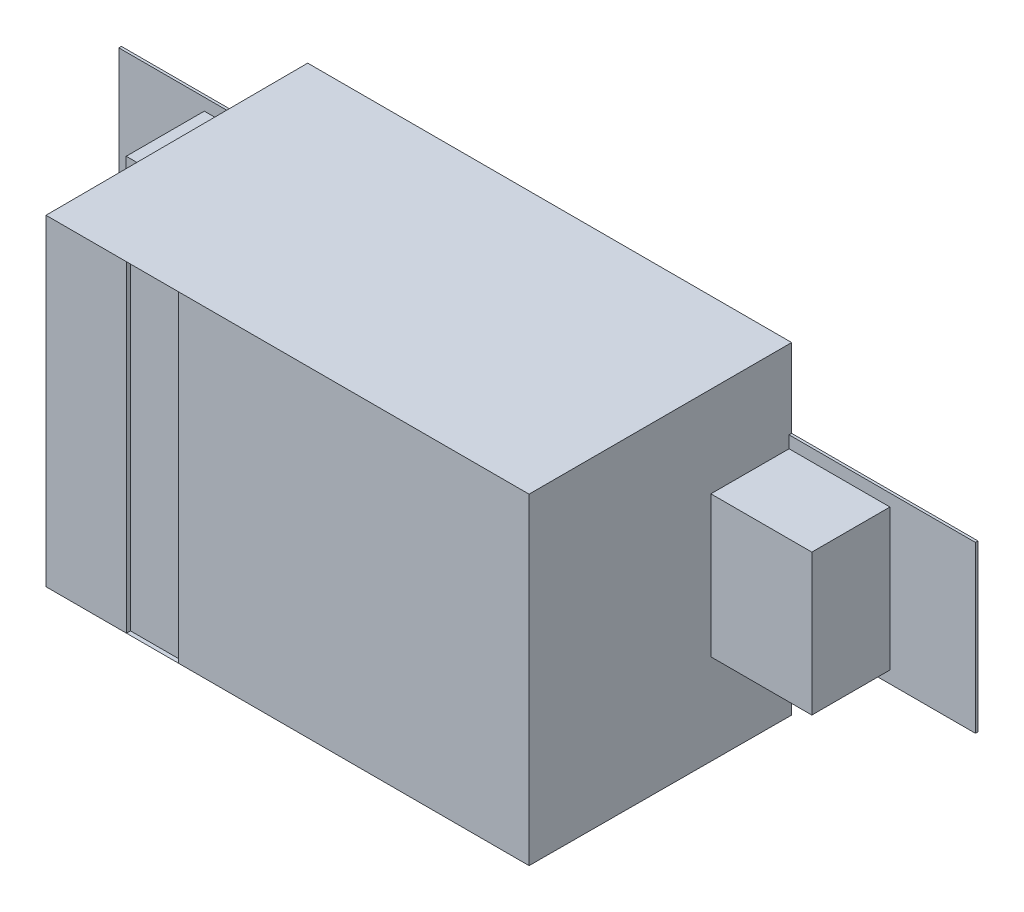
ISO-10303-21;
HEADER;
FILE_DESCRIPTION(('STEP AP214'),'2;1');
FILE_NAME('part.step','',(''),(''),'','','');
FILE_SCHEMA(('AUTOMOTIVE_DESIGN { 1 0 10303 214 1 1 1 1 }'));
ENDSEC;
DATA;
#1=APPLICATION_CONTEXT('core data for automotive mechanical design processes');
#2=APPLICATION_PROTOCOL_DEFINITION('international standard','automotive_design',2000,#1);
#3=PRODUCT_CONTEXT('',#1,'mechanical');
#4=PRODUCT('Part','Part','',(#3));
#5=PRODUCT_RELATED_PRODUCT_CATEGORY('part','',(#4));
#6=PRODUCT_DEFINITION_FORMATION('','',#4);
#7=PRODUCT_DEFINITION_CONTEXT('part definition',#1,'design');
#8=PRODUCT_DEFINITION('design','',#6,#7);
#9=PRODUCT_DEFINITION_SHAPE('','',#8);
#10=(LENGTH_UNIT() NAMED_UNIT(*) SI_UNIT(.MILLI.,.METRE.));
#11=(NAMED_UNIT(*) PLANE_ANGLE_UNIT() SI_UNIT($,.RADIAN.));
#12=(NAMED_UNIT(*) SI_UNIT($,.STERADIAN.) SOLID_ANGLE_UNIT());
#13=UNCERTAINTY_MEASURE_WITH_UNIT(LENGTH_MEASURE(1.E-05),#10,'distance_accuracy_value','');
#14=(GEOMETRIC_REPRESENTATION_CONTEXT(3) GLOBAL_UNCERTAINTY_ASSIGNED_CONTEXT((#13)) GLOBAL_UNIT_ASSIGNED_CONTEXT((#10,
#11,#12)) REPRESENTATION_CONTEXT('',''));
#15=CARTESIAN_POINT('',(0.,0.,0.));
#16=DIRECTION('',(0.,0.,1.));
#17=DIRECTION('',(1.,0.,0.));
#18=AXIS2_PLACEMENT_3D('',#15,#16,#17);
#19=CARTESIAN_POINT('',(0.849999999999902,0.175000000000011,0.0030000000000007));
#20=DIRECTION('',(1.,0.,0.));
#21=DIRECTION('',(0.,0.,-1.));
#22=AXIS2_PLACEMENT_3D('',#19,#20,#21);
#23=PLANE('',#22);
#24=DIRECTION('',(0.,0.,-1.));
#25=VECTOR('',#24,1.);
#26=CARTESIAN_POINT('',(0.849999999999902,-0.175000000000011,0.0030000000000007));
#27=LINE('',#26,#25);
#28=CARTESIAN_POINT('',(0.849999999999902,-0.175000000000011,0.0093500000000007));
#29=VERTEX_POINT('',#28);
#30=CARTESIAN_POINT('',(0.849999999999902,-0.175000000000011,0.203000000000001));
#31=VERTEX_POINT('',#30);
#32=EDGE_CURVE('E175',#29,#31,#27,.F.);
#33=ORIENTED_EDGE('',*,*,#32,.F.);
#34=DIRECTION('',(0.,1.,0.));
#35=VECTOR('',#34,1.);
#36=CARTESIAN_POINT('',(0.849999999999902,0.,0.0093500000000007));
#37=LINE('',#36,#35);
#38=CARTESIAN_POINT('',(0.849999999999902,0.175000000000011,0.0093500000000007));
#39=VERTEX_POINT('',#38);
#40=EDGE_CURVE('E182',#29,#39,#37,.T.);
#41=ORIENTED_EDGE('',*,*,#40,.T.);
#42=DIRECTION('',(0.,0.,1.));
#43=VECTOR('',#42,1.);
#44=CARTESIAN_POINT('',(0.849999999999902,0.175000000000011,0.0030000000000007));
#45=LINE('',#44,#43);
#46=CARTESIAN_POINT('',(0.849999999999902,0.175000000000011,0.203000000000001));
#47=VERTEX_POINT('',#46);
#48=EDGE_CURVE('E343',#47,#39,#45,.F.);
#49=ORIENTED_EDGE('',*,*,#48,.F.);
#50=DIRECTION('',(0.,1.,0.));
#51=VECTOR('',#50,1.);
#52=CARTESIAN_POINT('',(0.849999999999902,0.,0.203000000000001));
#53=LINE('',#52,#51);
#54=EDGE_CURVE('E194',#47,#31,#53,.F.);
#55=ORIENTED_EDGE('',*,*,#54,.T.);
#56=EDGE_LOOP('',(#33,#41,#49,#55));
#57=FACE_BOUND('',#56,.T.);
#58=ADVANCED_FACE('F17',(#57),#23,.T.);
#59=CARTESIAN_POINT('',(-0.849999999999902,-0.175000000000011,0.0030000000000007));
#60=DIRECTION('',(-1.,0.,0.));
#61=DIRECTION('',(0.,0.,1.));
#62=AXIS2_PLACEMENT_3D('',#59,#60,#61);
#63=PLANE('',#62);
#64=DIRECTION('',(0.,0.,1.));
#65=VECTOR('',#64,1.);
#66=CARTESIAN_POINT('',(-0.849999999999902,0.175000000000011,0.0030000000000007));
#67=LINE('',#66,#65);
#68=CARTESIAN_POINT('',(-0.849999999999902,0.175000000000011,0.0093500000000007));
#69=VERTEX_POINT('',#68);
#70=CARTESIAN_POINT('',(-0.849999999999902,0.175000000000011,0.203000000000001));
#71=VERTEX_POINT('',#70);
#72=EDGE_CURVE('E323',#69,#71,#67,.T.);
#73=ORIENTED_EDGE('',*,*,#72,.F.);
#74=DIRECTION('',(0.,1.,0.));
#75=VECTOR('',#74,1.);
#76=CARTESIAN_POINT('',(-0.849999999999902,0.,0.0093500000000007));
#77=LINE('',#76,#75);
#78=CARTESIAN_POINT('',(-0.849999999999902,-0.175000000000011,0.0093500000000007));
#79=VERTEX_POINT('',#78);
#80=EDGE_CURVE('E330',#69,#79,#77,.F.);
#81=ORIENTED_EDGE('',*,*,#80,.T.);
#82=DIRECTION('',(0.,0.,-1.));
#83=VECTOR('',#82,1.);
#84=CARTESIAN_POINT('',(-0.849999999999902,-0.175000000000011,0.0030000000000007));
#85=LINE('',#84,#83);
#86=CARTESIAN_POINT('',(-0.849999999999902,-0.175000000000011,0.203000000000001));
#87=VERTEX_POINT('',#86);
#88=EDGE_CURVE('E312',#87,#79,#85,.T.);
#89=ORIENTED_EDGE('',*,*,#88,.F.);
#90=DIRECTION('',(0.,1.,0.));
#91=VECTOR('',#90,1.);
#92=CARTESIAN_POINT('',(-0.849999999999902,0.,0.203000000000001));
#93=LINE('',#92,#91);
#94=EDGE_CURVE('E320',#87,#71,#93,.T.);
#95=ORIENTED_EDGE('',*,*,#94,.T.);
#96=EDGE_LOOP('',(#73,#81,#89,#95));
#97=FACE_BOUND('',#96,.T.);
#98=ADVANCED_FACE('F654',(#97),#63,.T.);
#99=CARTESIAN_POINT('',(-0.399389278385962,0.39886555926881,0.652985999999988));
#100=DIRECTION('',(-1.,0.,0.));
#101=DIRECTION('',(0.,0.,1.));
#102=AXIS2_PLACEMENT_3D('',#99,#100,#101);
#103=PLANE('',#102);
#104=DIRECTION('',(0.,1.,0.));
#105=VECTOR('',#104,1.);
#106=CARTESIAN_POINT('',(-0.399389278385962,0.,0.642986000000028));
#107=LINE('',#106,#105);
#108=CARTESIAN_POINT('',(-0.399389278385962,0.39886555926881,0.642986000000028));
#109=VERTEX_POINT('',#108);
#110=CARTESIAN_POINT('',(-0.399389278385962,-0.39886555926881,0.642986000000028));
#111=VERTEX_POINT('',#110);
#112=EDGE_CURVE('E203',#109,#111,#107,.F.);
#113=ORIENTED_EDGE('',*,*,#112,.F.);
#114=DIRECTION('',(0.,0.,1.));
#115=VECTOR('',#114,1.);
#116=CARTESIAN_POINT('',(-0.399389278385962,0.39886555926881,0.652985999999988));
#117=LINE('',#116,#115);
#118=CARTESIAN_POINT('',(-0.399389278385962,0.398865559268813,0.652985999999988));
#119=VERTEX_POINT('',#118);
#120=EDGE_CURVE('E223',#109,#119,#117,.T.);
#121=ORIENTED_EDGE('',*,*,#120,.T.);
#122=DIRECTION('',(0.,1.,0.));
#123=VECTOR('',#122,1.);
#124=CARTESIAN_POINT('',(-0.399389278385962,0.,0.652985999999988));
#125=LINE('',#124,#123);
#126=CARTESIAN_POINT('',(-0.399389278385962,-0.398865559268813,0.652985999999988));
#127=VERTEX_POINT('',#126);
#128=EDGE_CURVE('E220',#127,#119,#125,.T.);
#129=ORIENTED_EDGE('',*,*,#128,.F.);
#130=DIRECTION('',(0.,0.,1.));
#131=VECTOR('',#130,1.);
#132=CARTESIAN_POINT('',(-0.399389278385962,-0.39886555926881,0.652985999999988));
#133=LINE('',#132,#131);
#134=EDGE_CURVE('E20',#111,#127,#133,.T.);
#135=ORIENTED_EDGE('',*,*,#134,.F.);
#136=EDGE_LOOP('',(#113,#121,#129,#135));
#137=FACE_BOUND('',#136,.T.);
#138=ADVANCED_FACE('F221',(#137),#103,.F.);
#139=CARTESIAN_POINT('',(-0.270648412093,-0.39886555926881,0.652985999999988));
#140=DIRECTION('',(1.,0.,0.));
#141=DIRECTION('',(0.,0.,-1.));
#142=AXIS2_PLACEMENT_3D('',#139,#140,#141);
#143=PLANE('',#142);
#144=DIRECTION('',(0.,1.,0.));
#145=VECTOR('',#144,1.);
#146=CARTESIAN_POINT('',(-0.270648412093,0.,0.642986000000028));
#147=LINE('',#146,#145);
#148=CARTESIAN_POINT('',(-0.270648412093,-0.39886555926881,0.642986000000028));
#149=VERTEX_POINT('',#148);
#150=CARTESIAN_POINT('',(-0.270648412093,0.39886555926881,0.642986000000028));
#151=VERTEX_POINT('',#150);
#152=EDGE_CURVE('E206',#149,#151,#147,.T.);
#153=ORIENTED_EDGE('',*,*,#152,.F.);
#154=DIRECTION('',(0.,0.,-1.));
#155=VECTOR('',#154,1.);
#156=CARTESIAN_POINT('',(-0.270648412093,-0.39886555926881,0.652985999999988));
#157=LINE('',#156,#155);
#158=CARTESIAN_POINT('',(-0.270648412093,-0.398865559268813,0.652985999999988));
#159=VERTEX_POINT('',#158);
#160=EDGE_CURVE('E207',#159,#149,#157,.T.);
#161=ORIENTED_EDGE('',*,*,#160,.F.);
#162=DIRECTION('',(0.,1.,0.));
#163=VECTOR('',#162,1.);
#164=CARTESIAN_POINT('',(-0.270648412093,0.,0.652985999999988));
#165=LINE('',#164,#163);
#166=CARTESIAN_POINT('',(-0.270648412093,0.398865559268813,0.652985999999988));
#167=VERTEX_POINT('',#166);
#168=EDGE_CURVE('E229',#167,#159,#165,.F.);
#169=ORIENTED_EDGE('',*,*,#168,.F.);
#170=DIRECTION('',(0.,0.,1.));
#171=VECTOR('',#170,1.);
#172=CARTESIAN_POINT('',(-0.270648412093,0.39886555926881,0.652985999999988));
#173=LINE('',#172,#171);
#174=EDGE_CURVE('E339',#167,#151,#173,.F.);
#175=ORIENTED_EDGE('',*,*,#174,.T.);
#176=EDGE_LOOP('',(#153,#161,#169,#175));
#177=FACE_BOUND('',#176,.T.);
#178=ADVANCED_FACE('F393',(#177),#143,.F.);
#179=CARTESIAN_POINT('',(0.,0.,0.642986000000028));
#180=DIRECTION('',(0.,0.,1.));
#181=DIRECTION('',(1.,0.,0.));
#182=AXIS2_PLACEMENT_3D('',#179,#180,#181);
#183=PLANE('',#182);
#184=DIRECTION('',(1.,0.,0.));
#185=VECTOR('',#184,1.);
#186=CARTESIAN_POINT('',(-0.270648412093,0.39886555926881,0.642986000000028));
#187=LINE('',#186,#185);
#188=EDGE_CURVE('E336',#151,#109,#187,.F.);
#189=ORIENTED_EDGE('',*,*,#188,.T.);
#190=ORIENTED_EDGE('',*,*,#112,.T.);
#191=DIRECTION('',(1.,0.,0.));
#192=VECTOR('',#191,1.);
#193=CARTESIAN_POINT('',(-0.399389278385962,-0.39886555926881,0.642986000000028));
#194=LINE('',#193,#192);
#195=EDGE_CURVE('E217',#111,#149,#194,.T.);
#196=ORIENTED_EDGE('',*,*,#195,.T.);
#197=ORIENTED_EDGE('',*,*,#152,.T.);
#198=EDGE_LOOP('',(#189,#190,#196,#197));
#199=FACE_BOUND('',#198,.T.);
#200=ADVANCED_FACE('F401',(#199),#183,.T.);
#201=CARTESIAN_POINT('',(0.,0.,0.0093500000000007));
#202=DIRECTION('',(0.,0.,-1.));
#203=DIRECTION('',(-1.,0.,0.));
#204=AXIS2_PLACEMENT_3D('',#201,#202,#203);
#205=PLANE('',#204);
#206=ORIENTED_EDGE('',*,*,#40,.F.);
#207=DIRECTION('',(1.,0.,0.));
#208=VECTOR('',#207,1.);
#209=CARTESIAN_POINT('',(0.849999999999902,-0.175000000000011,0.0093500000000007));
#210=LINE('',#209,#208);
#211=CARTESIAN_POINT('',(0.599988917147998,-0.175000000000011,0.00935000000000063));
#212=VERTEX_POINT('',#211);
#213=EDGE_CURVE('E184',#212,#29,#210,.T.);
#214=ORIENTED_EDGE('',*,*,#213,.F.);
#215=DIRECTION('',(0.,1.,0.));
#216=VECTOR('',#215,1.);
#217=CARTESIAN_POINT('',(0.599988917148036,0.,0.0093500000000007));
#218=LINE('',#217,#216);
#219=CARTESIAN_POINT('',(0.599988917147998,-0.204999999999993,0.00935000000000063));
#220=VERTEX_POINT('',#219);
#221=EDGE_CURVE('E190',#220,#212,#218,.T.);
#222=ORIENTED_EDGE('',*,*,#221,.F.);
#223=DIRECTION('',(1.,0.,0.));
#224=VECTOR('',#223,1.);
#225=CARTESIAN_POINT('',(1.06200000000007,-0.204999999999993,0.0093500000000007));
#226=LINE('',#225,#224);
#227=CARTESIAN_POINT('',(1.06200000000007,-0.204999999999993,0.0093500000000007));
#228=VERTEX_POINT('',#227);
#229=EDGE_CURVE('E304',#228,#220,#226,.F.);
#230=ORIENTED_EDGE('',*,*,#229,.F.);
#231=DIRECTION('',(0.,1.,0.));
#232=VECTOR('',#231,1.);
#233=CARTESIAN_POINT('',(1.06200000000007,0.204999999999993,0.0093500000000007));
#234=LINE('',#233,#232);
#235=CARTESIAN_POINT('',(1.06200000000007,0.204999999999993,0.0093500000000007));
#236=VERTEX_POINT('',#235);
#237=EDGE_CURVE('E302',#236,#228,#234,.F.);
#238=ORIENTED_EDGE('',*,*,#237,.F.);
#239=DIRECTION('',(1.,0.,0.));
#240=VECTOR('',#239,1.);
#241=CARTESIAN_POINT('',(0.372000000000036,0.204999999999993,0.0093500000000007));
#242=LINE('',#241,#240);
#243=CARTESIAN_POINT('',(0.599988917147998,0.204999999999993,0.00935000000000063));
#244=VERTEX_POINT('',#243);
#245=EDGE_CURVE('E298',#244,#236,#242,.T.);
#246=ORIENTED_EDGE('',*,*,#245,.F.);
#247=DIRECTION('',(0.,1.,0.));
#248=VECTOR('',#247,1.);
#249=CARTESIAN_POINT('',(0.599988917148036,0.,0.0093500000000007));
#250=LINE('',#249,#248);
#251=CARTESIAN_POINT('',(0.599988917147998,0.175000000000011,0.00935000000000063));
#252=VERTEX_POINT('',#251);
#253=EDGE_CURVE('E201',#252,#244,#250,.T.);
#254=ORIENTED_EDGE('',*,*,#253,.F.);
#255=DIRECTION('',(1.,0.,0.));
#256=VECTOR('',#255,1.);
#257=CARTESIAN_POINT('',(0.538999999999876,0.175000000000011,0.0093500000000007));
#258=LINE('',#257,#256);
#259=EDGE_CURVE('E187',#39,#252,#258,.F.);
#260=ORIENTED_EDGE('',*,*,#259,.F.);
#261=EDGE_LOOP('',(#206,#214,#222,#230,#238,#246,#254,#260));
#262=FACE_BOUND('',#261,.T.);
#263=ADVANCED_FACE('F183',(#262),#205,.F.);
#264=CARTESIAN_POINT('',(0.849999999999902,-0.175000000000011,0.0030000000000007));
#265=DIRECTION('',(0.,-1.,0.));
#266=DIRECTION('',(0.,0.,-1.));
#267=AXIS2_PLACEMENT_3D('',#264,#265,#266);
#268=PLANE('',#267);
#269=DIRECTION('',(0.00174532836589798,0.,-0.999998476913288));
#270=VECTOR('',#269,1.);
#271=CARTESIAN_POINT('',(0.599999999999886,-0.175000000000012,0.0030000000000007));
#272=LINE('',#271,#270);
#273=CARTESIAN_POINT('',(0.599650933795048,-0.175000000000011,0.203000000000001));
#274=VERTEX_POINT('',#273);
#275=EDGE_CURVE('E193',#212,#274,#272,.F.);
#276=ORIENTED_EDGE('',*,*,#275,.F.);
#277=ORIENTED_EDGE('',*,*,#213,.T.);
#278=ORIENTED_EDGE('',*,*,#32,.T.);
#279=DIRECTION('',(-1.,0.,0.));
#280=VECTOR('',#279,1.);
#281=CARTESIAN_POINT('',(0.,-0.175000000000011,0.203000000000001));
#282=LINE('',#281,#280);
#283=EDGE_CURVE('E348',#31,#274,#282,.T.);
#284=ORIENTED_EDGE('',*,*,#283,.T.);
#285=EDGE_LOOP('',(#276,#277,#278,#284));
#286=FACE_BOUND('',#285,.T.);
#287=ADVANCED_FACE('F192',(#286),#268,.T.);
#288=CARTESIAN_POINT('',(0.,0.,0.203000000000001));
#289=DIRECTION('',(0.,0.,-1.));
#290=DIRECTION('',(-1.,0.,0.));
#291=AXIS2_PLACEMENT_3D('',#288,#289,#290);
#292=PLANE('',#291);
#293=ORIENTED_EDGE('',*,*,#54,.F.);
#294=DIRECTION('',(1.,0.,0.));
#295=VECTOR('',#294,1.);
#296=CARTESIAN_POINT('',(0.538999999999876,0.175000000000011,0.203000000000001));
#297=LINE('',#296,#295);
#298=CARTESIAN_POINT('',(0.599650933795048,0.175000000000011,0.203000000000001));
#299=VERTEX_POINT('',#298);
#300=EDGE_CURVE('E345',#299,#47,#297,.T.);
#301=ORIENTED_EDGE('',*,*,#300,.F.);
#302=DIRECTION('',(0.,1.,0.));
#303=VECTOR('',#302,1.);
#304=CARTESIAN_POINT('',(0.599650933795048,-25.8310794389062,0.203000000000001));
#305=LINE('',#304,#303);
#306=EDGE_CURVE('E286',#274,#299,#305,.T.);
#307=ORIENTED_EDGE('',*,*,#306,.F.);
#308=ORIENTED_EDGE('',*,*,#283,.F.);
#309=EDGE_LOOP('',(#293,#301,#307,#308));
#310=FACE_BOUND('',#309,.T.);
#311=ADVANCED_FACE('F352',(#310),#292,.F.);
#312=CARTESIAN_POINT('',(0.538999999999876,0.175000000000011,0.0030000000000007));
#313=DIRECTION('',(0.,1.,0.));
#314=DIRECTION('',(0.,0.,1.));
#315=AXIS2_PLACEMENT_3D('',#312,#313,#314);
#316=PLANE('',#315);
#317=ORIENTED_EDGE('',*,*,#48,.T.);
#318=ORIENTED_EDGE('',*,*,#259,.T.);
#319=DIRECTION('',(0.00174532836589798,0.,-0.999998476913288));
#320=VECTOR('',#319,1.);
#321=CARTESIAN_POINT('',(0.599999999999886,0.175000000000012,0.0030000000000007));
#322=LINE('',#321,#320);
#323=EDGE_CURVE('E283',#299,#252,#322,.T.);
#324=ORIENTED_EDGE('',*,*,#323,.F.);
#325=ORIENTED_EDGE('',*,*,#300,.T.);
#326=EDGE_LOOP('',(#317,#318,#324,#325));
#327=FACE_BOUND('',#326,.T.);
#328=ADVANCED_FACE('F470',(#327),#316,.T.);
#329=CARTESIAN_POINT('',(-0.270648412093,0.39886555926881,0.652985999999988));
#330=DIRECTION('',(0.,1.,0.));
#331=DIRECTION('',(0.,0.,1.));
#332=AXIS2_PLACEMENT_3D('',#329,#330,#331);
#333=PLANE('',#332);
#334=ORIENTED_EDGE('',*,*,#188,.F.);
#335=ORIENTED_EDGE('',*,*,#174,.F.);
#336=DIRECTION('',(1.,0.,0.));
#337=VECTOR('',#336,1.);
#338=CARTESIAN_POINT('',(26.0310794389054,0.398865559268836,0.652985999999988));
#339=LINE('',#338,#337);
#340=EDGE_CURVE('E274',#119,#167,#339,.T.);
#341=ORIENTED_EDGE('',*,*,#340,.F.);
#342=ORIENTED_EDGE('',*,*,#120,.F.);
#343=EDGE_LOOP('',(#334,#335,#341,#342));
#344=FACE_BOUND('',#343,.T.);
#345=ADVANCED_FACE('F399',(#344),#333,.F.);
#346=CARTESIAN_POINT('',(0.,0.,0.0093500000000007));
#347=DIRECTION('',(0.,0.,-1.));
#348=DIRECTION('',(-1.,0.,0.));
#349=AXIS2_PLACEMENT_3D('',#346,#347,#348);
#350=PLANE('',#349);
#351=DIRECTION('',(0.,1.,0.));
#352=VECTOR('',#351,1.);
#353=CARTESIAN_POINT('',(-1.06200000000007,-0.204999999999993,0.0093500000000007));
#354=LINE('',#353,#352);
#355=CARTESIAN_POINT('',(-1.06200000000007,-0.204999999999993,0.0093500000000007));
#356=VERTEX_POINT('',#355);
#357=CARTESIAN_POINT('',(-1.06200000000007,0.204999999999993,0.0093500000000007));
#358=VERTEX_POINT('',#357);
#359=EDGE_CURVE('E269',#356,#358,#354,.T.);
#360=ORIENTED_EDGE('',*,*,#359,.F.);
#361=DIRECTION('',(1.,0.,0.));
#362=VECTOR('',#361,1.);
#363=CARTESIAN_POINT('',(-0.372000000000036,-0.204999999999993,0.0093500000000007));
#364=LINE('',#363,#362);
#365=CARTESIAN_POINT('',(-0.599988917147998,-0.204999999999993,0.00935000000000063));
#366=VERTEX_POINT('',#365);
#367=EDGE_CURVE('E265',#366,#356,#364,.F.);
#368=ORIENTED_EDGE('',*,*,#367,.F.);
#369=DIRECTION('',(0.,1.,0.));
#370=VECTOR('',#369,1.);
#371=CARTESIAN_POINT('',(-0.599988917148036,0.,0.0093500000000007));
#372=LINE('',#371,#370);
#373=CARTESIAN_POINT('',(-0.599988917147998,-0.175000000000011,0.00935000000000063));
#374=VERTEX_POINT('',#373);
#375=EDGE_CURVE('E328',#374,#366,#372,.F.);
#376=ORIENTED_EDGE('',*,*,#375,.F.);
#377=DIRECTION('',(1.,0.,0.));
#378=VECTOR('',#377,1.);
#379=CARTESIAN_POINT('',(-0.538999999999876,-0.175000000000011,0.0093500000000007));
#380=LINE('',#379,#378);
#381=EDGE_CURVE('E230',#79,#374,#380,.T.);
#382=ORIENTED_EDGE('',*,*,#381,.F.);
#383=ORIENTED_EDGE('',*,*,#80,.F.);
#384=DIRECTION('',(1.,0.,0.));
#385=VECTOR('',#384,1.);
#386=CARTESIAN_POINT('',(-0.849999999999902,0.175000000000011,0.0093500000000007));
#387=LINE('',#386,#385);
#388=CARTESIAN_POINT('',(-0.599988917147998,0.175000000000011,0.00935000000000063));
#389=VERTEX_POINT('',#388);
#390=EDGE_CURVE('E325',#389,#69,#387,.F.);
#391=ORIENTED_EDGE('',*,*,#390,.F.);
#392=DIRECTION('',(0.,1.,0.));
#393=VECTOR('',#392,1.);
#394=CARTESIAN_POINT('',(-0.599988917148036,0.,0.0093500000000007));
#395=LINE('',#394,#393);
#396=CARTESIAN_POINT('',(-0.599988917147998,0.204999999999993,0.00935000000000063));
#397=VERTEX_POINT('',#396);
#398=EDGE_CURVE('E333',#397,#389,#395,.F.);
#399=ORIENTED_EDGE('',*,*,#398,.F.);
#400=DIRECTION('',(1.,0.,0.));
#401=VECTOR('',#400,1.);
#402=CARTESIAN_POINT('',(-1.06200000000007,0.204999999999993,0.0093500000000007));
#403=LINE('',#402,#401);
#404=EDGE_CURVE('E271',#358,#397,#403,.T.);
#405=ORIENTED_EDGE('',*,*,#404,.F.);
#406=EDGE_LOOP('',(#360,#368,#376,#382,#383,#391,#399,#405));
#407=FACE_BOUND('',#406,.T.);
#408=ADVANCED_FACE('F463',(#407),#350,.F.);
#409=CARTESIAN_POINT('',(-0.849999999999902,0.175000000000011,0.0030000000000007));
#410=DIRECTION('',(0.,1.,0.));
#411=DIRECTION('',(0.,0.,1.));
#412=AXIS2_PLACEMENT_3D('',#409,#410,#411);
#413=PLANE('',#412);
#414=DIRECTION('',(-1.,0.,0.));
#415=VECTOR('',#414,1.);
#416=CARTESIAN_POINT('',(0.,0.175000000000011,0.203000000000001));
#417=LINE('',#416,#415);
#418=CARTESIAN_POINT('',(-0.599650933795048,0.175000000000011,0.203000000000001));
#419=VERTEX_POINT('',#418);
#420=EDGE_CURVE('E317',#71,#419,#417,.F.);
#421=ORIENTED_EDGE('',*,*,#420,.T.);
#422=DIRECTION('',(0.00174532836589798,0.,0.999998476913288));
#423=VECTOR('',#422,1.);
#424=CARTESIAN_POINT('',(-0.599999999999886,0.175000000000012,0.0030000000000007));
#425=LINE('',#424,#423);
#426=EDGE_CURVE('E261',#389,#419,#425,.T.);
#427=ORIENTED_EDGE('',*,*,#426,.F.);
#428=ORIENTED_EDGE('',*,*,#390,.T.);
#429=ORIENTED_EDGE('',*,*,#72,.T.);
#430=EDGE_LOOP('',(#421,#427,#428,#429));
#431=FACE_BOUND('',#430,.T.);
#432=ADVANCED_FACE('F459',(#431),#413,.T.);
#433=CARTESIAN_POINT('',(0.,0.,0.203000000000001));
#434=DIRECTION('',(0.,0.,-1.));
#435=DIRECTION('',(-1.,0.,0.));
#436=AXIS2_PLACEMENT_3D('',#433,#434,#435);
#437=PLANE('',#436);
#438=ORIENTED_EDGE('',*,*,#94,.F.);
#439=DIRECTION('',(1.,0.,0.));
#440=VECTOR('',#439,1.);
#441=CARTESIAN_POINT('',(-0.538999999999876,-0.175000000000011,0.203000000000001));
#442=LINE('',#441,#440);
#443=CARTESIAN_POINT('',(-0.599650933795048,-0.175000000000011,0.203000000000001));
#444=VERTEX_POINT('',#443);
#445=EDGE_CURVE('E314',#444,#87,#442,.F.);
#446=ORIENTED_EDGE('',*,*,#445,.F.);
#447=DIRECTION('',(0.,1.,0.));
#448=VECTOR('',#447,1.);
#449=CARTESIAN_POINT('',(-0.599650933795048,25.8310794389062,0.203000000000001));
#450=LINE('',#449,#448);
#451=EDGE_CURVE('E259',#419,#444,#450,.F.);
#452=ORIENTED_EDGE('',*,*,#451,.F.);
#453=ORIENTED_EDGE('',*,*,#420,.F.);
#454=EDGE_LOOP('',(#438,#446,#452,#453));
#455=FACE_BOUND('',#454,.T.);
#456=ADVANCED_FACE('F455',(#455),#437,.F.);
#457=CARTESIAN_POINT('',(-0.538999999999876,-0.175000000000011,0.0030000000000007));
#458=DIRECTION('',(0.,-1.,0.));
#459=DIRECTION('',(0.,0.,-1.));
#460=AXIS2_PLACEMENT_3D('',#457,#458,#459);
#461=PLANE('',#460);
#462=ORIENTED_EDGE('',*,*,#381,.T.);
#463=DIRECTION('',(0.00174532836589798,0.,0.999998476913288));
#464=VECTOR('',#463,1.);
#465=CARTESIAN_POINT('',(-0.599999999999886,-0.175000000000012,0.0030000000000007));
#466=LINE('',#465,#464);
#467=EDGE_CURVE('E256',#444,#374,#466,.F.);
#468=ORIENTED_EDGE('',*,*,#467,.F.);
#469=ORIENTED_EDGE('',*,*,#445,.T.);
#470=ORIENTED_EDGE('',*,*,#88,.T.);
#471=EDGE_LOOP('',(#462,#468,#469,#470));
#472=FACE_BOUND('',#471,.T.);
#473=ADVANCED_FACE('F452',(#472),#461,.T.);
#474=CARTESIAN_POINT('',(0.,0.,0.652985999999988));
#475=DIRECTION('',(0.,0.,1.));
#476=DIRECTION('',(1.,0.,0.));
#477=AXIS2_PLACEMENT_3D('',#474,#475,#476);
#478=PLANE('',#477);
#479=DIRECTION('',(1.,0.,0.));
#480=VECTOR('',#479,1.);
#481=CARTESIAN_POINT('',(-26.0310794389054,-0.398865559268836,0.652985999999988));
#482=LINE('',#481,#480);
#483=CARTESIAN_POINT('',(-0.598865559268969,-0.398865559268816,0.652985999999988));
#484=VERTEX_POINT('',#483);
#485=EDGE_CURVE('E234',#127,#484,#482,.F.);
#486=ORIENTED_EDGE('',*,*,#485,.F.);
#487=ORIENTED_EDGE('',*,*,#128,.T.);
#488=DIRECTION('',(1.,0.,0.));
#489=VECTOR('',#488,1.);
#490=CARTESIAN_POINT('',(26.0310794389054,0.398865559268836,0.652985999999988));
#491=LINE('',#490,#489);
#492=CARTESIAN_POINT('',(-0.598865559268969,0.398865559268817,0.652985999999988));
#493=VERTEX_POINT('',#492);
#494=EDGE_CURVE('E277',#493,#119,#491,.T.);
#495=ORIENTED_EDGE('',*,*,#494,.F.);
#496=DIRECTION('',(0.,1.,0.));
#497=VECTOR('',#496,1.);
#498=CARTESIAN_POINT('',(-0.598865559268798,25.8310794389062,0.652985999999988));
#499=LINE('',#498,#497);
#500=EDGE_CURVE('E242',#484,#493,#499,.T.);
#501=ORIENTED_EDGE('',*,*,#500,.F.);
#502=EDGE_LOOP('',(#486,#487,#495,#501));
#503=FACE_BOUND('',#502,.T.);
#504=ADVANCED_FACE('F241',(#503),#478,.T.);
#505=CARTESIAN_POINT('',(0.,0.,0.652985999999988));
#506=DIRECTION('',(0.,0.,1.));
#507=DIRECTION('',(1.,0.,0.));
#508=AXIS2_PLACEMENT_3D('',#505,#506,#507);
#509=PLANE('',#508);
#510=DIRECTION('',(1.,0.,0.));
#511=VECTOR('',#510,1.);
#512=CARTESIAN_POINT('',(26.0310794389054,0.398865559268836,0.652985999999988));
#513=LINE('',#512,#511);
#514=CARTESIAN_POINT('',(0.598865559268969,0.398865559268816,0.652985999999988));
#515=VERTEX_POINT('',#514);
#516=EDGE_CURVE('E281',#167,#515,#513,.T.);
#517=ORIENTED_EDGE('',*,*,#516,.F.);
#518=ORIENTED_EDGE('',*,*,#168,.T.);
#519=DIRECTION('',(1.,0.,0.));
#520=VECTOR('',#519,1.);
#521=CARTESIAN_POINT('',(-26.0310794389054,-0.398865559268836,0.652985999999988));
#522=LINE('',#521,#520);
#523=CARTESIAN_POINT('',(0.598865559268912,-0.398865559268817,0.652985999999988));
#524=VERTEX_POINT('',#523);
#525=EDGE_CURVE('E238',#524,#159,#522,.F.);
#526=ORIENTED_EDGE('',*,*,#525,.F.);
#527=DIRECTION('',(0.,1.,0.));
#528=VECTOR('',#527,1.);
#529=CARTESIAN_POINT('',(0.598865559268798,-25.8310794389062,0.652985999999988));
#530=LINE('',#529,#528);
#531=EDGE_CURVE('E292',#515,#524,#530,.F.);
#532=ORIENTED_EDGE('',*,*,#531,.F.);
#533=EDGE_LOOP('',(#517,#518,#526,#532));
#534=FACE_BOUND('',#533,.T.);
#535=ADVANCED_FACE('F389',(#534),#509,.T.);
#536=CARTESIAN_POINT('',(-0.399389278385962,-0.39886555926881,0.652985999999988));
#537=DIRECTION('',(0.,-1.,0.));
#538=DIRECTION('',(0.,0.,-1.));
#539=AXIS2_PLACEMENT_3D('',#536,#537,#538);
#540=PLANE('',#539);
#541=ORIENTED_EDGE('',*,*,#195,.F.);
#542=ORIENTED_EDGE('',*,*,#134,.T.);
#543=DIRECTION('',(1.,0.,0.));
#544=VECTOR('',#543,1.);
#545=CARTESIAN_POINT('',(-26.0310794389054,-0.398865559268836,0.652985999999988));
#546=LINE('',#545,#544);
#547=EDGE_CURVE('E215',#159,#127,#546,.F.);
#548=ORIENTED_EDGE('',*,*,#547,.F.);
#549=ORIENTED_EDGE('',*,*,#160,.T.);
#550=EDGE_LOOP('',(#541,#542,#548,#549));
#551=FACE_BOUND('',#550,.T.);
#552=ADVANCED_FACE('F213',(#551),#540,.F.);
#553=CARTESIAN_POINT('',(1.06200000000007,-0.204999999999993,0.0030000000000007));
#554=DIRECTION('',(0.,-1.,0.));
#555=DIRECTION('',(0.,0.,-1.));
#556=AXIS2_PLACEMENT_3D('',#553,#554,#555);
#557=PLANE('',#556);
#558=ORIENTED_EDGE('',*,*,#229,.T.);
#559=DIRECTION('',(0.00174532836589798,0.,-0.999998476913288));
#560=VECTOR('',#559,1.);
#561=CARTESIAN_POINT('',(0.599999999999886,-0.204999999999993,0.0030000000000007));
#562=LINE('',#561,#560);
#563=CARTESIAN_POINT('',(0.599999999999886,-0.204999999999993,0.0030000000000007));
#564=VERTEX_POINT('',#563);
#565=EDGE_CURVE('E289',#564,#220,#562,.F.);
#566=ORIENTED_EDGE('',*,*,#565,.F.);
#567=DIRECTION('',(1.,0.,0.));
#568=VECTOR('',#567,1.);
#569=CARTESIAN_POINT('',(0.,-0.204999999999993,0.0030000000000007));
#570=LINE('',#569,#568);
#571=CARTESIAN_POINT('',(1.06200000000007,-0.204999999999993,0.0030000000000007));
#572=VERTEX_POINT('',#571);
#573=EDGE_CURVE('E364',#564,#572,#570,.T.);
#574=ORIENTED_EDGE('',*,*,#573,.T.);
#575=DIRECTION('',(0.,0.,-1.));
#576=VECTOR('',#575,1.);
#577=CARTESIAN_POINT('',(1.06200000000007,-0.204999999999993,0.0030000000000007));
#578=LINE('',#577,#576);
#579=EDGE_CURVE('E300',#228,#572,#578,.T.);
#580=ORIENTED_EDGE('',*,*,#579,.F.);
#581=EDGE_LOOP('',(#558,#566,#574,#580));
#582=FACE_BOUND('',#581,.T.);
#583=ADVANCED_FACE('F361',(#582),#557,.T.);
#584=CARTESIAN_POINT('',(1.06200000000007,0.204999999999993,0.0030000000000007));
#585=DIRECTION('',(1.,0.,0.));
#586=DIRECTION('',(0.,0.,-1.));
#587=AXIS2_PLACEMENT_3D('',#584,#585,#586);
#588=PLANE('',#587);
#589=ORIENTED_EDGE('',*,*,#579,.T.);
#590=DIRECTION('',(0.,1.,0.));
#591=VECTOR('',#590,1.);
#592=CARTESIAN_POINT('',(1.06200000000007,0.,0.0030000000000007));
#593=LINE('',#592,#591);
#594=CARTESIAN_POINT('',(1.06200000000007,0.204999999999993,0.0030000000000007));
#595=VERTEX_POINT('',#594);
#596=EDGE_CURVE('E370',#572,#595,#593,.T.);
#597=ORIENTED_EDGE('',*,*,#596,.T.);
#598=DIRECTION('',(0.,0.,1.));
#599=VECTOR('',#598,1.);
#600=CARTESIAN_POINT('',(1.06200000000007,0.204999999999993,0.0030000000000007));
#601=LINE('',#600,#599);
#602=EDGE_CURVE('E296',#236,#595,#601,.F.);
#603=ORIENTED_EDGE('',*,*,#602,.F.);
#604=ORIENTED_EDGE('',*,*,#237,.T.);
#605=EDGE_LOOP('',(#589,#597,#603,#604));
#606=FACE_BOUND('',#605,.T.);
#607=ADVANCED_FACE('F368',(#606),#588,.T.);
#608=CARTESIAN_POINT('',(0.372000000000036,0.204999999999993,0.0030000000000007));
#609=DIRECTION('',(0.,1.,0.));
#610=DIRECTION('',(0.,0.,1.));
#611=AXIS2_PLACEMENT_3D('',#608,#609,#610);
#612=PLANE('',#611);
#613=DIRECTION('',(1.,0.,0.));
#614=VECTOR('',#613,1.);
#615=CARTESIAN_POINT('',(0.,0.204999999999993,0.0030000000000007));
#616=LINE('',#615,#614);
#617=CARTESIAN_POINT('',(0.599999999999886,0.204999999999993,0.0030000000000007));
#618=VERTEX_POINT('',#617);
#619=EDGE_CURVE('E377',#595,#618,#616,.F.);
#620=ORIENTED_EDGE('',*,*,#619,.T.);
#621=DIRECTION('',(0.00174532836589798,0.,-0.999998476913288));
#622=VECTOR('',#621,1.);
#623=CARTESIAN_POINT('',(0.599999999999886,0.204999999999993,0.0030000000000007));
#624=LINE('',#623,#622);
#625=EDGE_CURVE('E294',#244,#618,#624,.T.);
#626=ORIENTED_EDGE('',*,*,#625,.F.);
#627=ORIENTED_EDGE('',*,*,#245,.T.);
#628=ORIENTED_EDGE('',*,*,#602,.T.);
#629=EDGE_LOOP('',(#620,#626,#627,#628));
#630=FACE_BOUND('',#629,.T.);
#631=ADVANCED_FACE('F438',(#630),#612,.T.);
#632=CARTESIAN_POINT('',(0.599999999999886,-25.8310794389062,0.0030000000000007));
#633=DIRECTION('',(0.999998476913288,0.,0.00174532836589798));
#634=DIRECTION('',(0.00174532836589798,0.,-0.999998476913288));
#635=AXIS2_PLACEMENT_3D('',#632,#633,#634);
#636=PLANE('',#635);
#637=ORIENTED_EDGE('',*,*,#323,.T.);
#638=ORIENTED_EDGE('',*,*,#253,.T.);
#639=ORIENTED_EDGE('',*,*,#625,.T.);
#640=DIRECTION('',(0.,1.,0.));
#641=VECTOR('',#640,1.);
#642=CARTESIAN_POINT('',(0.599999999999886,0.,0.0030000000000007));
#643=LINE('',#642,#641);
#644=CARTESIAN_POINT('',(0.599999999999886,0.399999999999924,0.00300000000000069));
#645=VERTEX_POINT('',#644);
#646=EDGE_CURVE('E379',#618,#645,#643,.T.);
#647=ORIENTED_EDGE('',*,*,#646,.T.);
#648=DIRECTION('',(0.00174532570726543,0.00174532570761964,-0.999996953833535));
#649=VECTOR('',#648,1.);
#650=CARTESIAN_POINT('',(0.598865559269027,0.398865559268836,0.652985999999988));
#651=LINE('',#650,#649);
#652=EDGE_CURVE('E279',#515,#645,#651,.T.);
#653=ORIENTED_EDGE('',*,*,#652,.F.);
#654=ORIENTED_EDGE('',*,*,#531,.T.);
#655=DIRECTION('',(-0.00174532570726543,0.00174532570761964,0.999996953833535));
#656=VECTOR('',#655,1.);
#657=CARTESIAN_POINT('',(0.599999999999885,-0.399999999999924,0.0030000000000007));
#658=LINE('',#657,#656);
#659=CARTESIAN_POINT('',(0.599999999999886,-0.399999999999924,0.00300000000000071));
#660=VERTEX_POINT('',#659);
#661=EDGE_CURVE('E245',#660,#524,#658,.T.);
#662=ORIENTED_EDGE('',*,*,#661,.F.);
#663=DIRECTION('',(0.,1.,0.));
#664=VECTOR('',#663,1.);
#665=CARTESIAN_POINT('',(0.599999999999886,0.,0.0030000000000007));
#666=LINE('',#665,#664);
#667=EDGE_CURVE('E239',#660,#564,#666,.T.);
#668=ORIENTED_EDGE('',*,*,#667,.T.);
#669=ORIENTED_EDGE('',*,*,#565,.T.);
#670=ORIENTED_EDGE('',*,*,#221,.T.);
#671=ORIENTED_EDGE('',*,*,#275,.T.);
#672=ORIENTED_EDGE('',*,*,#306,.T.);
#673=EDGE_LOOP('',(#637,#638,#639,#647,#653,#654,#662,#668,#669,#670,#671,#672));
#674=FACE_BOUND('',#673,.T.);
#675=ADVANCED_FACE('F355',(#674),#636,.T.);
#676=CARTESIAN_POINT('',(26.0310794389054,0.399999999999924,0.0030000000000007));
#677=DIRECTION('',(0.,0.999998476913288,0.00174532836589798));
#678=DIRECTION('',(0.,-0.00174532836589798,0.999998476913288));
#679=AXIS2_PLACEMENT_3D('',#676,#677,#678);
#680=PLANE('',#679);
#681=ORIENTED_EDGE('',*,*,#494,.T.);
#682=ORIENTED_EDGE('',*,*,#340,.T.);
#683=ORIENTED_EDGE('',*,*,#516,.T.);
#684=ORIENTED_EDGE('',*,*,#652,.T.);
#685=DIRECTION('',(1.,0.,0.));
#686=VECTOR('',#685,1.);
#687=CARTESIAN_POINT('',(0.,0.399999999999924,0.0030000000000007));
#688=LINE('',#687,#686);
#689=CARTESIAN_POINT('',(-0.599999999999886,0.399999999999924,0.0030000000000007));
#690=VERTEX_POINT('',#689);
#691=EDGE_CURVE('E704',#645,#690,#688,.F.);
#692=ORIENTED_EDGE('',*,*,#691,.T.);
#693=DIRECTION('',(-0.00174532570761955,0.00174532570766042,-0.999996953833535));
#694=VECTOR('',#693,1.);
#695=CARTESIAN_POINT('',(-0.598865559268798,0.39886555926881,0.652985999999988));
#696=LINE('',#695,#694);
#697=EDGE_CURVE('E248',#493,#690,#696,.T.);
#698=ORIENTED_EDGE('',*,*,#697,.F.);
#699=EDGE_LOOP('',(#681,#682,#683,#684,#692,#698));
#700=FACE_BOUND('',#699,.T.);
#701=ADVANCED_FACE('F395',(#700),#680,.T.);
#702=CARTESIAN_POINT('',(-1.06200000000007,0.204999999999993,0.0030000000000007));
#703=DIRECTION('',(0.,1.,0.));
#704=DIRECTION('',(0.,0.,1.));
#705=AXIS2_PLACEMENT_3D('',#702,#703,#704);
#706=PLANE('',#705);
#707=ORIENTED_EDGE('',*,*,#404,.T.);
#708=DIRECTION('',(0.00174532836589798,0.,0.999998476913288));
#709=VECTOR('',#708,1.);
#710=CARTESIAN_POINT('',(-0.599999999999886,0.204999999999993,0.0030000000000007));
#711=LINE('',#710,#709);
#712=CARTESIAN_POINT('',(-0.599999999999886,0.204999999999993,0.0030000000000007));
#713=VERTEX_POINT('',#712);
#714=EDGE_CURVE('E243',#713,#397,#711,.T.);
#715=ORIENTED_EDGE('',*,*,#714,.F.);
#716=DIRECTION('',(1.,0.,0.));
#717=VECTOR('',#716,1.);
#718=CARTESIAN_POINT('',(0.,0.204999999999993,0.0030000000000007));
#719=LINE('',#718,#717);
#720=CARTESIAN_POINT('',(-1.06200000000007,0.204999999999993,0.0030000000000007));
#721=VERTEX_POINT('',#720);
#722=EDGE_CURVE('E697',#713,#721,#719,.F.);
#723=ORIENTED_EDGE('',*,*,#722,.T.);
#724=DIRECTION('',(0.,0.,1.));
#725=VECTOR('',#724,1.);
#726=CARTESIAN_POINT('',(-1.06200000000007,0.204999999999993,0.0030000000000007));
#727=LINE('',#726,#725);
#728=EDGE_CURVE('E267',#358,#721,#727,.F.);
#729=ORIENTED_EDGE('',*,*,#728,.F.);
#730=EDGE_LOOP('',(#707,#715,#723,#729));
#731=FACE_BOUND('',#730,.T.);
#732=ADVANCED_FACE('F429',(#731),#706,.T.);
#733=CARTESIAN_POINT('',(-1.06200000000007,-0.204999999999993,0.0030000000000007));
#734=DIRECTION('',(-1.,0.,0.));
#735=DIRECTION('',(0.,0.,1.));
#736=AXIS2_PLACEMENT_3D('',#733,#734,#735);
#737=PLANE('',#736);
#738=ORIENTED_EDGE('',*,*,#728,.T.);
#739=DIRECTION('',(0.,1.,0.));
#740=VECTOR('',#739,1.);
#741=CARTESIAN_POINT('',(-1.06200000000007,0.,0.0030000000000007));
#742=LINE('',#741,#740);
#743=CARTESIAN_POINT('',(-1.06200000000007,-0.204999999999993,0.0030000000000007));
#744=VERTEX_POINT('',#743);
#745=EDGE_CURVE('E695',#721,#744,#742,.F.);
#746=ORIENTED_EDGE('',*,*,#745,.T.);
#747=DIRECTION('',(0.,0.,-1.));
#748=VECTOR('',#747,1.);
#749=CARTESIAN_POINT('',(-1.06200000000007,-0.204999999999993,0.0030000000000007));
#750=LINE('',#749,#748);
#751=EDGE_CURVE('E263',#356,#744,#750,.T.);
#752=ORIENTED_EDGE('',*,*,#751,.F.);
#753=ORIENTED_EDGE('',*,*,#359,.T.);
#754=EDGE_LOOP('',(#738,#746,#752,#753));
#755=FACE_BOUND('',#754,.T.);
#756=ADVANCED_FACE('F425',(#755),#737,.T.);
#757=CARTESIAN_POINT('',(-0.372000000000036,-0.204999999999993,0.0030000000000007));
#758=DIRECTION('',(0.,-1.,0.));
#759=DIRECTION('',(0.,0.,-1.));
#760=AXIS2_PLACEMENT_3D('',#757,#758,#759);
#761=PLANE('',#760);
#762=DIRECTION('',(1.,0.,0.));
#763=VECTOR('',#762,1.);
#764=CARTESIAN_POINT('',(0.,-0.204999999999993,0.0030000000000007));
#765=LINE('',#764,#763);
#766=CARTESIAN_POINT('',(-0.599999999999886,-0.204999999999993,0.0030000000000007));
#767=VERTEX_POINT('',#766);
#768=EDGE_CURVE('E691',#744,#767,#765,.T.);
#769=ORIENTED_EDGE('',*,*,#768,.T.);
#770=DIRECTION('',(0.00174532836589798,0.,0.999998476913288));
#771=VECTOR('',#770,1.);
#772=CARTESIAN_POINT('',(-0.599999999999886,-0.204999999999993,0.0030000000000007));
#773=LINE('',#772,#771);
#774=EDGE_CURVE('E254',#366,#767,#773,.F.);
#775=ORIENTED_EDGE('',*,*,#774,.F.);
#776=ORIENTED_EDGE('',*,*,#367,.T.);
#777=ORIENTED_EDGE('',*,*,#751,.T.);
#778=EDGE_LOOP('',(#769,#775,#776,#777));
#779=FACE_BOUND('',#778,.T.);
#780=ADVANCED_FACE('F421',(#779),#761,.T.);
#781=CARTESIAN_POINT('',(-0.599999999999886,25.8310794389062,0.0030000000000007));
#782=DIRECTION('',(-0.999998476913288,0.,0.00174532836589798));
#783=DIRECTION('',(0.00174532836589798,0.,0.999998476913288));
#784=AXIS2_PLACEMENT_3D('',#781,#782,#783);
#785=PLANE('',#784);
#786=ORIENTED_EDGE('',*,*,#714,.T.);
#787=ORIENTED_EDGE('',*,*,#398,.T.);
#788=ORIENTED_EDGE('',*,*,#426,.T.);
#789=ORIENTED_EDGE('',*,*,#451,.T.);
#790=ORIENTED_EDGE('',*,*,#467,.T.);
#791=ORIENTED_EDGE('',*,*,#375,.T.);
#792=ORIENTED_EDGE('',*,*,#774,.T.);
#793=DIRECTION('',(0.,1.,0.));
#794=VECTOR('',#793,1.);
#795=CARTESIAN_POINT('',(-0.599999999999886,0.,0.0030000000000007));
#796=LINE('',#795,#794);
#797=CARTESIAN_POINT('',(-0.599999999999886,-0.399999999999924,0.00300000000000069));
#798=VERTEX_POINT('',#797);
#799=EDGE_CURVE('E26',#767,#798,#796,.F.);
#800=ORIENTED_EDGE('',*,*,#799,.T.);
#801=DIRECTION('',(-0.00174532570726543,-0.00174532570761964,-0.999996953833535));
#802=VECTOR('',#801,1.);
#803=CARTESIAN_POINT('',(-0.598865559269027,-0.398865559268836,0.652985999999988));
#804=LINE('',#803,#802);
#805=EDGE_CURVE('E34',#484,#798,#804,.T.);
#806=ORIENTED_EDGE('',*,*,#805,.F.);
#807=ORIENTED_EDGE('',*,*,#500,.T.);
#808=ORIENTED_EDGE('',*,*,#697,.T.);
#809=DIRECTION('',(0.,1.,0.));
#810=VECTOR('',#809,1.);
#811=CARTESIAN_POINT('',(-0.599999999999886,0.,0.0030000000000007));
#812=LINE('',#811,#810);
#813=EDGE_CURVE('E702',#690,#713,#812,.F.);
#814=ORIENTED_EDGE('',*,*,#813,.T.);
#815=EDGE_LOOP('',(#786,#787,#788,#789,#790,#791,#792,#800,#806,#807,#808,#814));
#816=FACE_BOUND('',#815,.T.);
#817=ADVANCED_FACE('F416',(#816),#785,.T.);
#818=CARTESIAN_POINT('',(-26.0310794389054,-0.399999999999924,0.0030000000000007));
#819=DIRECTION('',(0.,-0.999998476913288,0.00174532836589798));
#820=DIRECTION('',(0.,-0.00174532836589798,-0.999998476913288));
#821=AXIS2_PLACEMENT_3D('',#818,#819,#820);
#822=PLANE('',#821);
#823=ORIENTED_EDGE('',*,*,#525,.T.);
#824=ORIENTED_EDGE('',*,*,#547,.T.);
#825=ORIENTED_EDGE('',*,*,#485,.T.);
#826=ORIENTED_EDGE('',*,*,#805,.T.);
#827=DIRECTION('',(1.,0.,0.));
#828=VECTOR('',#827,1.);
#829=CARTESIAN_POINT('',(0.,-0.399999999999924,0.0030000000000007));
#830=LINE('',#829,#828);
#831=EDGE_CURVE('E11',#798,#660,#830,.T.);
#832=ORIENTED_EDGE('',*,*,#831,.T.);
#833=ORIENTED_EDGE('',*,*,#661,.T.);
#834=EDGE_LOOP('',(#823,#824,#825,#826,#832,#833));
#835=FACE_BOUND('',#834,.T.);
#836=ADVANCED_FACE('F233',(#835),#822,.T.);
#837=CARTESIAN_POINT('',(0.,0.,0.0030000000000007));
#838=DIRECTION('',(0.,0.,1.));
#839=DIRECTION('',(1.,0.,0.));
#840=AXIS2_PLACEMENT_3D('',#837,#838,#839);
#841=PLANE('',#840);
#842=ORIENTED_EDGE('',*,*,#799,.F.);
#843=ORIENTED_EDGE('',*,*,#768,.F.);
#844=ORIENTED_EDGE('',*,*,#745,.F.);
#845=ORIENTED_EDGE('',*,*,#722,.F.);
#846=ORIENTED_EDGE('',*,*,#813,.F.);
#847=ORIENTED_EDGE('',*,*,#691,.F.);
#848=ORIENTED_EDGE('',*,*,#646,.F.);
#849=ORIENTED_EDGE('',*,*,#619,.F.);
#850=ORIENTED_EDGE('',*,*,#596,.F.);
#851=ORIENTED_EDGE('',*,*,#573,.F.);
#852=ORIENTED_EDGE('',*,*,#667,.F.);
#853=ORIENTED_EDGE('',*,*,#831,.F.);
#854=EDGE_LOOP('',(#842,#843,#844,#845,#846,#847,#848,#849,#850,#851,#852,#853));
#855=FACE_BOUND('',#854,.T.);
#856=ADVANCED_FACE('F374',(#855),#841,.F.);
#857=CLOSED_SHELL('',(#58,#98,#138,#178,#200,#263,#287,#311,#328,#345,#408,#432,#456,#473,#504,
#535,#552,#583,#607,#631,#675,#701,#732,#756,#780,#817,#836,#856));
#858=MANIFOLD_SOLID_BREP('B1',#857);
#859=ADVANCED_BREP_SHAPE_REPRESENTATION('',(#18,#858),#14);
#860=SHAPE_DEFINITION_REPRESENTATION(#9,#859);
ENDSEC;
END-ISO-10303-21;
